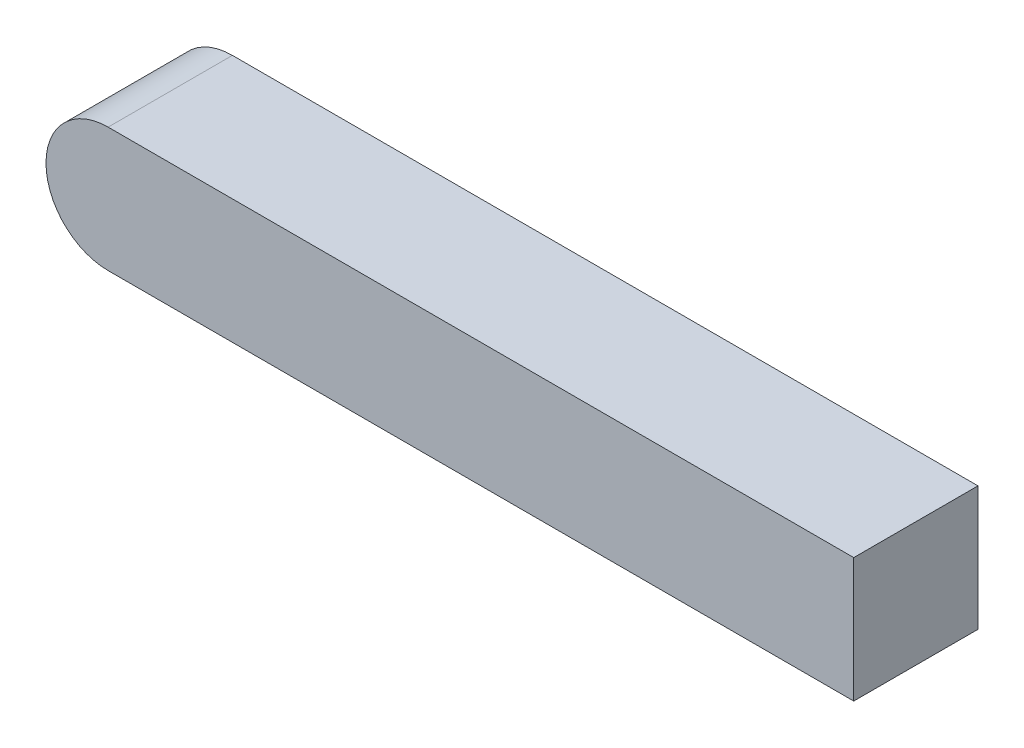
ISO-10303-21;
HEADER;
FILE_DESCRIPTION(('STEP AP214'),'2;1');
FILE_NAME('part.step','',(''),(''),'','','');
FILE_SCHEMA(('AUTOMOTIVE_DESIGN { 1 0 10303 214 1 1 1 1 }'));
ENDSEC;
DATA;
#1=APPLICATION_CONTEXT('core data for automotive mechanical design processes');
#2=APPLICATION_PROTOCOL_DEFINITION('international standard','automotive_design',2000,#1);
#3=PRODUCT_CONTEXT('',#1,'mechanical');
#4=PRODUCT('Part','Part','',(#3));
#5=PRODUCT_RELATED_PRODUCT_CATEGORY('part','',(#4));
#6=PRODUCT_DEFINITION_FORMATION('','',#4);
#7=PRODUCT_DEFINITION_CONTEXT('part definition',#1,'design');
#8=PRODUCT_DEFINITION('design','',#6,#7);
#9=PRODUCT_DEFINITION_SHAPE('','',#8);
#10=(LENGTH_UNIT() NAMED_UNIT(*) SI_UNIT(.MILLI.,.METRE.));
#11=(NAMED_UNIT(*) PLANE_ANGLE_UNIT() SI_UNIT($,.RADIAN.));
#12=(NAMED_UNIT(*) SI_UNIT($,.STERADIAN.) SOLID_ANGLE_UNIT());
#13=UNCERTAINTY_MEASURE_WITH_UNIT(LENGTH_MEASURE(1.E-05),#10,'distance_accuracy_value','');
#14=(GEOMETRIC_REPRESENTATION_CONTEXT(3) GLOBAL_UNCERTAINTY_ASSIGNED_CONTEXT((#13)) GLOBAL_UNIT_ASSIGNED_CONTEXT((#10,
#11,#12)) REPRESENTATION_CONTEXT('',''));
#15=CARTESIAN_POINT('',(0.,0.,0.));
#16=DIRECTION('',(0.,0.,1.));
#17=DIRECTION('',(1.,0.,0.));
#18=AXIS2_PLACEMENT_3D('',#15,#16,#17);
#19=CARTESIAN_POINT('',(0.,-4.00000000000016,8.));
#20=DIRECTION('',(0.,1.,0.));
#21=DIRECTION('',(0.,0.,1.));
#22=AXIS2_PLACEMENT_3D('',#19,#20,#21);
#23=PLANE('',#22);
#24=DIRECTION('',(1.,0.,0.));
#25=VECTOR('',#24,1.);
#26=CARTESIAN_POINT('',(0.,-4.00000000000016,0.));
#27=LINE('',#26,#25);
#28=CARTESIAN_POINT('',(0.,-4.00000000000007,0.));
#29=VERTEX_POINT('',#28);
#30=CARTESIAN_POINT('',(48.,-4.00000000000016,0.));
#31=VERTEX_POINT('',#30);
#32=EDGE_CURVE('E98',#29,#31,#27,.T.);
#33=ORIENTED_EDGE('',*,*,#32,.T.);
#34=DIRECTION('',(0.,0.,-1.));
#35=VECTOR('',#34,1.);
#36=CARTESIAN_POINT('',(48.,-4.00000000000016,8.));
#37=LINE('',#36,#35);
#38=CARTESIAN_POINT('',(48.,-4.00000000000016,8.));
#39=VERTEX_POINT('',#38);
#40=EDGE_CURVE('E11',#39,#31,#37,.T.);
#41=ORIENTED_EDGE('',*,*,#40,.F.);
#42=DIRECTION('',(1.,0.,0.));
#43=VECTOR('',#42,1.);
#44=CARTESIAN_POINT('',(0.,-4.00000000000016,8.));
#45=LINE('',#44,#43);
#46=CARTESIAN_POINT('',(0.,-4.00000000000007,8.));
#47=VERTEX_POINT('',#46);
#48=EDGE_CURVE('E86',#47,#39,#45,.T.);
#49=ORIENTED_EDGE('',*,*,#48,.F.);
#50=DIRECTION('',(0.,0.,-1.));
#51=VECTOR('',#50,1.);
#52=CARTESIAN_POINT('',(0.,-4.00000000000007,8.));
#53=LINE('',#52,#51);
#54=EDGE_CURVE('E94',#47,#29,#53,.T.);
#55=ORIENTED_EDGE('',*,*,#54,.T.);
#56=EDGE_LOOP('',(#33,#41,#49,#55));
#57=FACE_BOUND('',#56,.T.);
#58=ADVANCED_FACE('F35',(#57),#23,.F.);
#59=CARTESIAN_POINT('',(48.,-4.00000000000016,8.));
#60=DIRECTION('',(-1.,0.,0.));
#61=DIRECTION('',(0.,0.,1.));
#62=AXIS2_PLACEMENT_3D('',#59,#60,#61);
#63=PLANE('',#62);
#64=DIRECTION('',(0.,1.,0.));
#65=VECTOR('',#64,1.);
#66=CARTESIAN_POINT('',(48.,-4.00000000000016,0.));
#67=LINE('',#66,#65);
#68=CARTESIAN_POINT('',(48.,3.99999999999984,0.));
#69=VERTEX_POINT('',#68);
#70=EDGE_CURVE('E90',#31,#69,#67,.T.);
#71=ORIENTED_EDGE('',*,*,#70,.T.);
#72=DIRECTION('',(0.,0.,-1.));
#73=VECTOR('',#72,1.);
#74=CARTESIAN_POINT('',(48.,3.99999999999984,8.));
#75=LINE('',#74,#73);
#76=CARTESIAN_POINT('',(48.,3.99999999999984,8.));
#77=VERTEX_POINT('',#76);
#78=EDGE_CURVE('E43',#77,#69,#75,.T.);
#79=ORIENTED_EDGE('',*,*,#78,.F.);
#80=DIRECTION('',(0.,1.,0.));
#81=VECTOR('',#80,1.);
#82=CARTESIAN_POINT('',(48.,-4.00000000000016,8.));
#83=LINE('',#82,#81);
#84=EDGE_CURVE('E81',#39,#77,#83,.T.);
#85=ORIENTED_EDGE('',*,*,#84,.F.);
#86=ORIENTED_EDGE('',*,*,#40,.T.);
#87=EDGE_LOOP('',(#71,#79,#85,#86));
#88=FACE_BOUND('',#87,.T.);
#89=ADVANCED_FACE('F89',(#88),#63,.F.);
#90=CARTESIAN_POINT('',(48.,3.99999999999984,8.));
#91=DIRECTION('',(0.,-1.,0.));
#92=DIRECTION('',(1.,0.,0.));
#93=AXIS2_PLACEMENT_3D('',#90,#91,#92);
#94=PLANE('',#93);
#95=DIRECTION('',(-1.,0.,0.));
#96=VECTOR('',#95,1.);
#97=CARTESIAN_POINT('',(48.,3.99999999999984,0.));
#98=LINE('',#97,#96);
#99=CARTESIAN_POINT('',(0.,3.99999999999999,0.));
#100=VERTEX_POINT('',#99);
#101=EDGE_CURVE('E68',#69,#100,#98,.T.);
#102=ORIENTED_EDGE('',*,*,#101,.T.);
#103=DIRECTION('',(0.,0.,-1.));
#104=VECTOR('',#103,1.);
#105=CARTESIAN_POINT('',(0.,3.99999999999999,8.));
#106=LINE('',#105,#104);
#107=CARTESIAN_POINT('',(0.,3.99999999999999,8.));
#108=VERTEX_POINT('',#107);
#109=EDGE_CURVE('E91',#108,#100,#106,.T.);
#110=ORIENTED_EDGE('',*,*,#109,.F.);
#111=DIRECTION('',(-1.,0.,0.));
#112=VECTOR('',#111,1.);
#113=CARTESIAN_POINT('',(48.,3.99999999999984,8.));
#114=LINE('',#113,#112);
#115=EDGE_CURVE('E84',#77,#108,#114,.T.);
#116=ORIENTED_EDGE('',*,*,#115,.F.);
#117=ORIENTED_EDGE('',*,*,#78,.T.);
#118=EDGE_LOOP('',(#102,#110,#116,#117));
#119=FACE_BOUND('',#118,.T.);
#120=ADVANCED_FACE('F92',(#119),#94,.F.);
#121=CARTESIAN_POINT('',(0.,0.,8.));
#122=DIRECTION('',(0.,0.,-1.));
#123=DIRECTION('',(-1.,0.,0.));
#124=AXIS2_PLACEMENT_3D('',#121,#122,#123);
#125=CYLINDRICAL_SURFACE('',#124,4.00000000000007);
#126=CARTESIAN_POINT('',(0.,0.,0.));
#127=DIRECTION('',(0.,0.,1.));
#128=DIRECTION('',(1.,0.,0.));
#129=AXIS2_PLACEMENT_3D('',#126,#127,#128);
#130=CIRCLE('',#129,4.00000000000007);
#131=EDGE_CURVE('E74',#100,#29,#130,.T.);
#132=ORIENTED_EDGE('',*,*,#131,.T.);
#133=ORIENTED_EDGE('',*,*,#54,.F.);
#134=CARTESIAN_POINT('',(0.,0.,8.));
#135=DIRECTION('',(0.,0.,1.));
#136=DIRECTION('',(1.,0.,0.));
#137=AXIS2_PLACEMENT_3D('',#134,#135,#136);
#138=CIRCLE('',#137,4.00000000000007);
#139=EDGE_CURVE('E51',#108,#47,#138,.T.);
#140=ORIENTED_EDGE('',*,*,#139,.F.);
#141=ORIENTED_EDGE('',*,*,#109,.T.);
#142=EDGE_LOOP('',(#132,#133,#140,#141));
#143=FACE_BOUND('',#142,.T.);
#144=ADVANCED_FACE('F105',(#143),#125,.T.);
#145=CARTESIAN_POINT('',(0.,0.,8.));
#146=DIRECTION('',(0.,0.,1.));
#147=DIRECTION('',(1.,0.,0.));
#148=AXIS2_PLACEMENT_3D('',#145,#146,#147);
#149=PLANE('',#148);
#150=ORIENTED_EDGE('',*,*,#48,.T.);
#151=ORIENTED_EDGE('',*,*,#84,.T.);
#152=ORIENTED_EDGE('',*,*,#115,.T.);
#153=ORIENTED_EDGE('',*,*,#139,.T.);
#154=EDGE_LOOP('',(#150,#151,#152,#153));
#155=FACE_BOUND('',#154,.T.);
#156=ADVANCED_FACE('F82',(#155),#149,.T.);
#157=CARTESIAN_POINT('',(0.,0.,0.));
#158=DIRECTION('',(0.,0.,1.));
#159=DIRECTION('',(1.,0.,0.));
#160=AXIS2_PLACEMENT_3D('',#157,#158,#159);
#161=PLANE('',#160);
#162=ORIENTED_EDGE('',*,*,#32,.F.);
#163=ORIENTED_EDGE('',*,*,#131,.F.);
#164=ORIENTED_EDGE('',*,*,#101,.F.);
#165=ORIENTED_EDGE('',*,*,#70,.F.);
#166=EDGE_LOOP('',(#162,#163,#164,#165));
#167=FACE_BOUND('',#166,.T.);
#168=ADVANCED_FACE('F108',(#167),#161,.F.);
#169=CLOSED_SHELL('',(#58,#89,#120,#144,#156,#168));
#170=MANIFOLD_SOLID_BREP('B2',#169);
#171=ADVANCED_BREP_SHAPE_REPRESENTATION('',(#18,#170),#14);
#172=SHAPE_DEFINITION_REPRESENTATION(#9,#171);
ENDSEC;
END-ISO-10303-21;
